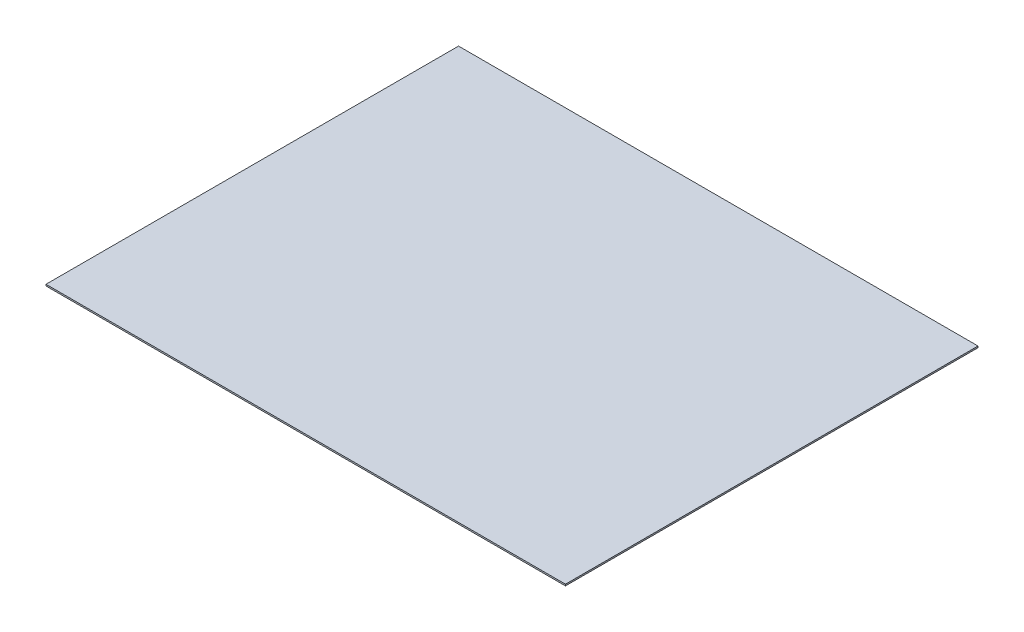
ISO-10303-21;
HEADER;
FILE_DESCRIPTION(('STEP AP214'),'2;1');
FILE_NAME('part.step','',(''),(''),'','','');
FILE_SCHEMA(('AUTOMOTIVE_DESIGN { 1 0 10303 214 1 1 1 1 }'));
ENDSEC;
DATA;
#1=APPLICATION_CONTEXT('core data for automotive mechanical design processes');
#2=APPLICATION_PROTOCOL_DEFINITION('international standard','automotive_design',2000,#1);
#3=PRODUCT_CONTEXT('',#1,'mechanical');
#4=PRODUCT('Part','Part','',(#3));
#5=PRODUCT_RELATED_PRODUCT_CATEGORY('part','',(#4));
#6=PRODUCT_DEFINITION_FORMATION('','',#4);
#7=PRODUCT_DEFINITION_CONTEXT('part definition',#1,'design');
#8=PRODUCT_DEFINITION('design','',#6,#7);
#9=PRODUCT_DEFINITION_SHAPE('','',#8);
#10=(LENGTH_UNIT() NAMED_UNIT(*) SI_UNIT(.MILLI.,.METRE.));
#11=(NAMED_UNIT(*) PLANE_ANGLE_UNIT() SI_UNIT($,.RADIAN.));
#12=(NAMED_UNIT(*) SI_UNIT($,.STERADIAN.) SOLID_ANGLE_UNIT());
#13=UNCERTAINTY_MEASURE_WITH_UNIT(LENGTH_MEASURE(1.E-05),#10,'distance_accuracy_value','');
#14=(GEOMETRIC_REPRESENTATION_CONTEXT(3) GLOBAL_UNCERTAINTY_ASSIGNED_CONTEXT((#13)) GLOBAL_UNIT_ASSIGNED_CONTEXT((#10,
#11,#12)) REPRESENTATION_CONTEXT('',''));
#15=CARTESIAN_POINT('',(0.,0.,0.));
#16=DIRECTION('',(0.,0.,1.));
#17=DIRECTION('',(1.,0.,0.));
#18=AXIS2_PLACEMENT_3D('',#15,#16,#17);
#19=CARTESIAN_POINT('',(0.,-1.,360.));
#20=DIRECTION('',(0.,0.,1.));
#21=DIRECTION('',(1.,0.,0.));
#22=AXIS2_PLACEMENT_3D('',#19,#20,#21);
#23=PLANE('',#22);
#24=DIRECTION('',(-1.,0.,0.));
#25=VECTOR('',#24,1.);
#26=CARTESIAN_POINT('',(0.,-2.,360.));
#27=LINE('',#26,#25);
#28=CARTESIAN_POINT('',(340.,-2.,360.));
#29=VERTEX_POINT('',#28);
#30=CARTESIAN_POINT('',(-340.,-2.,360.));
#31=VERTEX_POINT('',#30);
#32=EDGE_CURVE('E10',#29,#31,#27,.T.);
#33=ORIENTED_EDGE('',*,*,#32,.F.);
#34=DIRECTION('',(0.,-1.,0.));
#35=VECTOR('',#34,1.);
#36=CARTESIAN_POINT('',(340.,-1.,360.));
#37=LINE('',#36,#35);
#38=CARTESIAN_POINT('',(340.,0.,360.));
#39=VERTEX_POINT('',#38);
#40=EDGE_CURVE('E60',#39,#29,#37,.T.);
#41=ORIENTED_EDGE('',*,*,#40,.F.);
#42=DIRECTION('',(1.,0.,0.));
#43=VECTOR('',#42,1.);
#44=CARTESIAN_POINT('',(0.,0.,360.));
#45=LINE('',#44,#43);
#46=CARTESIAN_POINT('',(-340.,0.,360.));
#47=VERTEX_POINT('',#46);
#48=EDGE_CURVE('E86',#47,#39,#45,.T.);
#49=ORIENTED_EDGE('',*,*,#48,.F.);
#50=DIRECTION('',(0.,1.,0.));
#51=VECTOR('',#50,1.);
#52=CARTESIAN_POINT('',(-340.,-1.,360.));
#53=LINE('',#52,#51);
#54=EDGE_CURVE('E23',#31,#47,#53,.T.);
#55=ORIENTED_EDGE('',*,*,#54,.F.);
#56=EDGE_LOOP('',(#33,#41,#49,#55));
#57=FACE_BOUND('',#56,.T.);
#58=ADVANCED_FACE('F16',(#57),#23,.T.);
#59=CARTESIAN_POINT('',(0.,-2.,-180.));
#60=DIRECTION('',(0.,-1.,0.));
#61=DIRECTION('',(0.,0.,-1.));
#62=AXIS2_PLACEMENT_3D('',#59,#60,#61);
#63=PLANE('',#62);
#64=DIRECTION('',(0.,0.,1.));
#65=VECTOR('',#64,1.);
#66=CARTESIAN_POINT('',(340.,-2.,-180.));
#67=LINE('',#66,#65);
#68=CARTESIAN_POINT('',(340.,-2.,-180.));
#69=VERTEX_POINT('',#68);
#70=EDGE_CURVE('E53',#69,#29,#67,.T.);
#71=ORIENTED_EDGE('',*,*,#70,.T.);
#72=ORIENTED_EDGE('',*,*,#32,.T.);
#73=DIRECTION('',(0.,0.,1.));
#74=VECTOR('',#73,1.);
#75=CARTESIAN_POINT('',(-340.,-2.,-180.));
#76=LINE('',#75,#74);
#77=CARTESIAN_POINT('',(-340.,-2.,-180.));
#78=VERTEX_POINT('',#77);
#79=EDGE_CURVE('E66',#78,#31,#76,.T.);
#80=ORIENTED_EDGE('',*,*,#79,.F.);
#81=DIRECTION('',(1.,0.,0.));
#82=VECTOR('',#81,1.);
#83=CARTESIAN_POINT('',(0.,-2.,-180.));
#84=LINE('',#83,#82);
#85=EDGE_CURVE('E64',#78,#69,#84,.T.);
#86=ORIENTED_EDGE('',*,*,#85,.T.);
#87=EDGE_LOOP('',(#71,#72,#80,#86));
#88=FACE_BOUND('',#87,.T.);
#89=ADVANCED_FACE('F65',(#88),#63,.T.);
#90=CARTESIAN_POINT('',(-340.,-1.,-180.));
#91=DIRECTION('',(-1.,0.,0.));
#92=DIRECTION('',(0.,0.,1.));
#93=AXIS2_PLACEMENT_3D('',#90,#91,#92);
#94=PLANE('',#93);
#95=ORIENTED_EDGE('',*,*,#79,.T.);
#96=ORIENTED_EDGE('',*,*,#54,.T.);
#97=DIRECTION('',(0.,0.,1.));
#98=VECTOR('',#97,1.);
#99=CARTESIAN_POINT('',(-340.,0.,-180.));
#100=LINE('',#99,#98);
#101=CARTESIAN_POINT('',(-340.,0.,-180.));
#102=VERTEX_POINT('',#101);
#103=EDGE_CURVE('E81',#102,#47,#100,.T.);
#104=ORIENTED_EDGE('',*,*,#103,.F.);
#105=DIRECTION('',(0.,-1.,0.));
#106=VECTOR('',#105,1.);
#107=CARTESIAN_POINT('',(-340.,-1.,-180.));
#108=LINE('',#107,#106);
#109=EDGE_CURVE('E70',#102,#78,#108,.T.);
#110=ORIENTED_EDGE('',*,*,#109,.T.);
#111=EDGE_LOOP('',(#95,#96,#104,#110));
#112=FACE_BOUND('',#111,.T.);
#113=ADVANCED_FACE('F90',(#112),#94,.T.);
#114=CARTESIAN_POINT('',(0.,0.,-180.));
#115=DIRECTION('',(0.,1.,0.));
#116=DIRECTION('',(0.,0.,1.));
#117=AXIS2_PLACEMENT_3D('',#114,#115,#116);
#118=PLANE('',#117);
#119=ORIENTED_EDGE('',*,*,#103,.T.);
#120=ORIENTED_EDGE('',*,*,#48,.T.);
#121=DIRECTION('',(0.,0.,1.));
#122=VECTOR('',#121,1.);
#123=CARTESIAN_POINT('',(340.,0.,-180.));
#124=LINE('',#123,#122);
#125=CARTESIAN_POINT('',(340.,0.,-180.));
#126=VERTEX_POINT('',#125);
#127=EDGE_CURVE('E61',#126,#39,#124,.T.);
#128=ORIENTED_EDGE('',*,*,#127,.F.);
#129=DIRECTION('',(-1.,0.,0.));
#130=VECTOR('',#129,1.);
#131=CARTESIAN_POINT('',(0.,0.,-180.));
#132=LINE('',#131,#130);
#133=EDGE_CURVE('E75',#126,#102,#132,.T.);
#134=ORIENTED_EDGE('',*,*,#133,.T.);
#135=EDGE_LOOP('',(#119,#120,#128,#134));
#136=FACE_BOUND('',#135,.T.);
#137=ADVANCED_FACE('F88',(#136),#118,.T.);
#138=CARTESIAN_POINT('',(0.,-1.,-180.));
#139=DIRECTION('',(0.,0.,-1.));
#140=DIRECTION('',(-1.,0.,0.));
#141=AXIS2_PLACEMENT_3D('',#138,#139,#140);
#142=PLANE('',#141);
#143=DIRECTION('',(0.,1.,0.));
#144=VECTOR('',#143,1.);
#145=CARTESIAN_POINT('',(340.,-1.,-180.));
#146=LINE('',#145,#144);
#147=EDGE_CURVE('E58',#69,#126,#146,.T.);
#148=ORIENTED_EDGE('',*,*,#147,.F.);
#149=ORIENTED_EDGE('',*,*,#85,.F.);
#150=ORIENTED_EDGE('',*,*,#109,.F.);
#151=ORIENTED_EDGE('',*,*,#133,.F.);
#152=EDGE_LOOP('',(#148,#149,#150,#151));
#153=FACE_BOUND('',#152,.T.);
#154=ADVANCED_FACE('F73',(#153),#142,.T.);
#155=CARTESIAN_POINT('',(340.,-1.,-180.));
#156=DIRECTION('',(1.,0.,0.));
#157=DIRECTION('',(0.,0.,-1.));
#158=AXIS2_PLACEMENT_3D('',#155,#156,#157);
#159=PLANE('',#158);
#160=ORIENTED_EDGE('',*,*,#147,.T.);
#161=ORIENTED_EDGE('',*,*,#127,.T.);
#162=ORIENTED_EDGE('',*,*,#40,.T.);
#163=ORIENTED_EDGE('',*,*,#70,.F.);
#164=EDGE_LOOP('',(#160,#161,#162,#163));
#165=FACE_BOUND('',#164,.T.);
#166=ADVANCED_FACE('F55',(#165),#159,.T.);
#167=CLOSED_SHELL('',(#58,#89,#113,#137,#154,#166));
#168=MANIFOLD_SOLID_BREP('B1',#167);
#169=ADVANCED_BREP_SHAPE_REPRESENTATION('',(#18,#168),#14);
#170=SHAPE_DEFINITION_REPRESENTATION(#9,#169);
ENDSEC;
END-ISO-10303-21;
